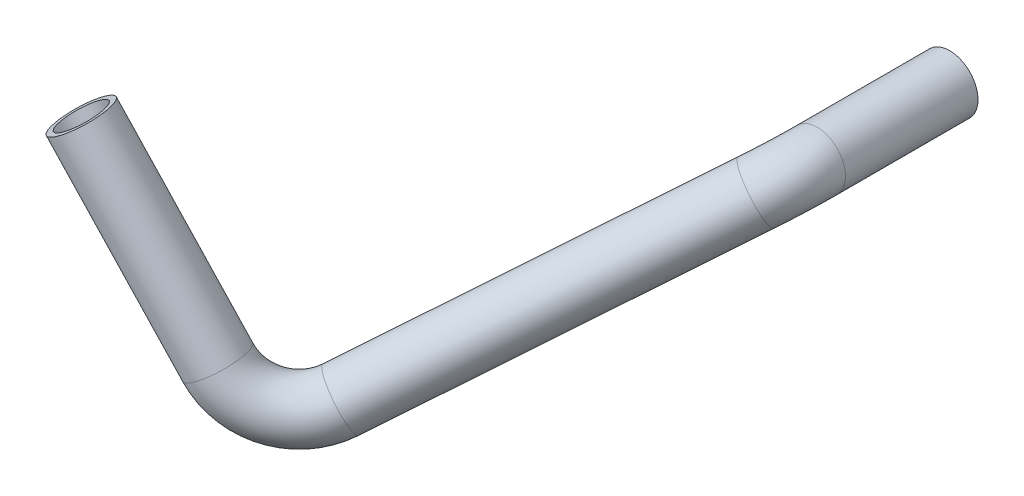
ISO-10303-21;
HEADER;
FILE_DESCRIPTION(('STEP AP214'),'2;1');
FILE_NAME('part.step','',(''),(''),'','','');
FILE_SCHEMA(('AUTOMOTIVE_DESIGN { 1 0 10303 214 1 1 1 1 }'));
ENDSEC;
DATA;
#1=APPLICATION_CONTEXT('core data for automotive mechanical design processes');
#2=APPLICATION_PROTOCOL_DEFINITION('international standard','automotive_design',2000,#1);
#3=PRODUCT_CONTEXT('',#1,'mechanical');
#4=PRODUCT('Part','Part','',(#3));
#5=PRODUCT_RELATED_PRODUCT_CATEGORY('part','',(#4));
#6=PRODUCT_DEFINITION_FORMATION('','',#4);
#7=PRODUCT_DEFINITION_CONTEXT('part definition',#1,'design');
#8=PRODUCT_DEFINITION('design','',#6,#7);
#9=PRODUCT_DEFINITION_SHAPE('','',#8);
#10=(LENGTH_UNIT() NAMED_UNIT(*) SI_UNIT(.MILLI.,.METRE.));
#11=(NAMED_UNIT(*) PLANE_ANGLE_UNIT() SI_UNIT($,.RADIAN.));
#12=(NAMED_UNIT(*) SI_UNIT($,.STERADIAN.) SOLID_ANGLE_UNIT());
#13=UNCERTAINTY_MEASURE_WITH_UNIT(LENGTH_MEASURE(1.E-05),#10,'distance_accuracy_value','');
#14=(GEOMETRIC_REPRESENTATION_CONTEXT(3) GLOBAL_UNCERTAINTY_ASSIGNED_CONTEXT((#13)) GLOBAL_UNIT_ASSIGNED_CONTEXT((#10,
#11,#12)) REPRESENTATION_CONTEXT('',''));
#15=CARTESIAN_POINT('',(0.,0.,0.));
#16=DIRECTION('',(0.,0.,1.));
#17=DIRECTION('',(1.,0.,0.));
#18=AXIS2_PLACEMENT_3D('',#15,#16,#17);
#19=CARTESIAN_POINT('',(0.,0.,0.));
#20=DIRECTION('',(0.,0.,1.));
#21=DIRECTION('',(1.,0.,0.));
#22=AXIS2_PLACEMENT_3D('',#19,#20,#21);
#23=PLANE('',#22);
#24=CARTESIAN_POINT('',(0.,0.,0.));
#25=DIRECTION('',(0.,0.,1.));
#26=DIRECTION('',(1.,0.,0.));
#27=AXIS2_PLACEMENT_3D('',#24,#25,#26);
#28=CIRCLE('',#27,16.764);
#29=CARTESIAN_POINT('',(16.764,0.,0.));
#30=VERTEX_POINT('',#29);
#31=EDGE_CURVE('E35',#30,#30,#28,.T.);
#32=ORIENTED_EDGE('',*,*,#31,.F.);
#33=EDGE_LOOP('',(#32));
#34=FACE_BOUND('',#33,.T.);
#35=CARTESIAN_POINT('',(0.,0.,0.));
#36=DIRECTION('',(0.,0.,1.));
#37=DIRECTION('',(1.,0.,0.));
#38=AXIS2_PLACEMENT_3D('',#35,#36,#37);
#39=CIRCLE('',#38,13.3858);
#40=CARTESIAN_POINT('',(13.3858,0.,0.));
#41=VERTEX_POINT('',#40);
#42=EDGE_CURVE('E42',#41,#41,#39,.T.);
#43=ORIENTED_EDGE('',*,*,#42,.T.);
#44=EDGE_LOOP('',(#43));
#45=FACE_BOUND('',#44,.T.);
#46=ADVANCED_FACE('F31',(#34,#45),#23,.F.);
#47=CARTESIAN_POINT('',(0.,0.,78.4330587896097));
#48=DIRECTION('',(0.,0.,-1.));
#49=DIRECTION('',(-1.,0.,0.));
#50=AXIS2_PLACEMENT_3D('',#47,#48,#49);
#51=CYLINDRICAL_SURFACE('',#50,16.764);
#52=CARTESIAN_POINT('',(0.,0.,78.4330587896097));
#53=DIRECTION('',(0.,0.,1.));
#54=DIRECTION('',(1.,0.,0.));
#55=AXIS2_PLACEMENT_3D('',#52,#53,#54);
#56=CIRCLE('',#55,16.764);
#57=CARTESIAN_POINT('',(12.8035668024698,10.8212925815123,78.4330587896097));
#58=VERTEX_POINT('',#57);
#59=EDGE_CURVE('E10',#58,#58,#56,.T.);
#60=ORIENTED_EDGE('',*,*,#59,.F.);
#61=EDGE_LOOP('',(#60));
#62=FACE_BOUND('',#61,.T.);
#63=ORIENTED_EDGE('',*,*,#31,.T.);
#64=EDGE_LOOP('',(#63));
#65=FACE_BOUND('',#64,.T.);
#66=ADVANCED_FACE('F33',(#62,#65),#51,.T.);
#67=CARTESIAN_POINT('',(0.,0.,78.4330587896097));
#68=DIRECTION('',(0.,0.,-1.));
#69=DIRECTION('',(-1.,0.,0.));
#70=AXIS2_PLACEMENT_3D('',#67,#68,#69);
#71=CYLINDRICAL_SURFACE('',#70,13.3858);
#72=CARTESIAN_POINT('',(0.,0.,78.4330587896097));
#73=DIRECTION('',(0.,0.,1.));
#74=DIRECTION('',(1.,0.,0.));
#75=AXIS2_PLACEMENT_3D('',#72,#73,#74);
#76=CIRCLE('',#75,13.3858);
#77=CARTESIAN_POINT('',(10.2234540983357,8.64063816735909,78.4330587896097));
#78=VERTEX_POINT('',#77);
#79=EDGE_CURVE('E49',#78,#78,#76,.T.);
#80=ORIENTED_EDGE('',*,*,#79,.T.);
#81=EDGE_LOOP('',(#80));
#82=FACE_BOUND('',#81,.T.);
#83=ORIENTED_EDGE('',*,*,#42,.F.);
#84=EDGE_LOOP('',(#83));
#85=FACE_BOUND('',#84,.T.);
#86=ADVANCED_FACE('F98',(#82,#85),#71,.F.);
#87=CARTESIAN_POINT('',(-29.0990154601586,-24.5938467761644,78.4330587896097));
#88=DIRECTION('',(-0.64550778940064,0.763753686618336,0.));
#89=DIRECTION('',(-0.763753686618336,-0.64550778940064,0.));
#90=AXIS2_PLACEMENT_3D('',#87,#88,#89);
#91=TOROIDAL_SURFACE('',#90,38.1,13.3858);
#92=CARTESIAN_POINT('',(-8.8192299398295,-7.45381884555164,105.756304237163));
#93=DIRECTION('',(-0.547722557505165,-0.462923038532848,0.696923425058677));
#94=DIRECTION('',(0.786241676829558,0.,0.617919109282311));
#95=AXIS2_PLACEMENT_3D('',#92,#93,#94);
#96=CIRCLE('',#95,13.3858);
#97=CARTESIAN_POINT('',(-1.69426529368721,-1.43195569926302,115.355871137737));
#98=VERTEX_POINT('',#97);
#99=EDGE_CURVE('E55',#98,#98,#96,.T.);
#100=CARTESIAN_POINT('',(-29.0990154601586,-24.5938467761644,78.4330587896097));
#101=DIRECTION('',(-0.64550778940064,0.763753686618336,0.));
#102=DIRECTION('',(-0.763753686618336,-0.64550778940064,0.));
#103=AXIS2_PLACEMENT_3D('',#100,#101,#102);
#104=CIRCLE('',#103,51.4858);
#105=EDGE_CURVE('',#98,#78,#104,.T.);
#106=ORIENTED_EDGE('',*,*,#99,.T.);
#107=ORIENTED_EDGE('',*,*,#79,.F.);
#108=ORIENTED_EDGE('',*,*,#105,.T.);
#109=ORIENTED_EDGE('',*,*,#105,.F.);
#110=EDGE_LOOP('',(#106,#108,#107,#109));
#111=FACE_BOUND('',#110,.T.);
#112=ADVANCED_FACE('F105',(#111),#91,.F.);
#113=CARTESIAN_POINT('',(-29.0990154601586,-24.5938467761644,78.4330587896097));
#114=DIRECTION('',(-0.64550778940064,0.763753686618336,0.));
#115=DIRECTION('',(-0.763753686618336,-0.64550778940064,0.));
#116=AXIS2_PLACEMENT_3D('',#113,#114,#115);
#117=TOROIDAL_SURFACE('',#116,38.1,16.764);
#118=CARTESIAN_POINT('',(-8.81922993982949,-7.45381884555162,105.756304237163));
#119=DIRECTION('',(-0.547722557505165,-0.462923038532848,0.696923425058677));
#120=DIRECTION('',(0.823209465100274,-0.149419465162081,0.547722557505165));
#121=AXIS2_PLACEMENT_3D('',#118,#119,#120);
#122=CIRCLE('',#121,16.764);
#123=CARTESIAN_POINT('',(0.103875689115317,0.0877934439180023,117.778532234087));
#124=VERTEX_POINT('',#123);
#125=EDGE_CURVE('E46',#124,#124,#122,.T.);
#126=CARTESIAN_POINT('',(-29.0990154601586,-24.5938467761644,78.4330587896097));
#127=DIRECTION('',(-0.64550778940064,0.763753686618336,0.));
#128=DIRECTION('',(-0.763753686618336,-0.64550778940064,0.));
#129=AXIS2_PLACEMENT_3D('',#126,#127,#128);
#130=CIRCLE('',#129,54.864);
#131=EDGE_CURVE('',#124,#58,#130,.T.);
#132=ORIENTED_EDGE('',*,*,#125,.F.);
#133=ORIENTED_EDGE('',*,*,#59,.T.);
#134=ORIENTED_EDGE('',*,*,#131,.T.);
#135=ORIENTED_EDGE('',*,*,#131,.F.);
#136=EDGE_LOOP('',(#132,#134,#133,#135));
#137=FACE_BOUND('',#136,.T.);
#138=ADVANCED_FACE('F107',(#137),#117,.T.);
#139=CARTESIAN_POINT('',(-116.960840040428,-98.8527251962934,243.355934323529));
#140=DIRECTION('',(0.547722557505165,0.462923038532848,-0.696923425058677));
#141=DIRECTION('',(-0.786241676829558,0.,-0.617919109282311));
#142=AXIS2_PLACEMENT_3D('',#139,#140,#141);
#143=CYLINDRICAL_SURFACE('',#142,16.764);
#144=CARTESIAN_POINT('',(-116.960840040428,-98.8527251962934,243.355934323529));
#145=DIRECTION('',(-0.547722557505165,-0.462923038532848,0.696923425058677));
#146=DIRECTION('',(0.786241676829558,0.,0.617919109282311));
#147=AXIS2_PLACEMENT_3D('',#144,#145,#146);
#148=CIRCLE('',#147,16.764);
#149=CARTESIAN_POINT('',(-107.778819086411,-112.734514316936,241.35140993854));
#150=VERTEX_POINT('',#149);
#151=EDGE_CURVE('E52',#150,#150,#148,.T.);
#152=ORIENTED_EDGE('',*,*,#151,.F.);
#153=EDGE_LOOP('',(#152));
#154=FACE_BOUND('',#153,.T.);
#155=ORIENTED_EDGE('',*,*,#125,.T.);
#156=EDGE_LOOP('',(#155));
#157=FACE_BOUND('',#156,.T.);
#158=ADVANCED_FACE('F110',(#154,#157),#143,.T.);
#159=CARTESIAN_POINT('',(-116.960840040428,-98.8527251962934,243.355934323529));
#160=DIRECTION('',(0.547722557505165,0.462923038532848,-0.696923425058677));
#161=DIRECTION('',(-0.786241676829558,0.,-0.617919109282311));
#162=AXIS2_PLACEMENT_3D('',#159,#160,#161);
#163=CYLINDRICAL_SURFACE('',#162,13.3858);
#164=CARTESIAN_POINT('',(-116.960840040428,-98.8527251962935,243.355934323529));
#165=DIRECTION('',(-0.547722557505165,-0.462923038532848,0.696923425058677));
#166=DIRECTION('',(0.786241676829558,0.,0.617919109282311));
#167=AXIS2_PLACEMENT_3D('',#164,#165,#166);
#168=CIRCLE('',#167,13.3858);
#169=CARTESIAN_POINT('',(-109.629135430175,-109.937123478988,241.755351973697));
#170=VERTEX_POINT('',#169);
#171=EDGE_CURVE('E61',#170,#170,#168,.T.);
#172=ORIENTED_EDGE('',*,*,#171,.T.);
#173=EDGE_LOOP('',(#172));
#174=FACE_BOUND('',#173,.T.);
#175=ORIENTED_EDGE('',*,*,#99,.F.);
#176=EDGE_LOOP('',(#175));
#177=FACE_BOUND('',#176,.T.);
#178=ADVANCED_FACE('F117',(#174,#177),#163,.F.);
#179=CARTESIAN_POINT('',(-137.829069481375,-67.3032044675606,247.91167156214));
#180=DIRECTION('',(0.632455532033677,0.316227766016838,0.707106781186547));
#181=DIRECTION('',(0.745355992499929,0.,-0.666666666666667));
#182=AXIS2_PLACEMENT_3D('',#179,#180,#181);
#183=TOROIDAL_SURFACE('',#182,38.1000000000002,13.3858);
#184=CARTESIAN_POINT('',(-158.697298922321,-84.9405722356622,274.464454056876));
#185=DIRECTION('',(-0.547722557505167,0.828071410202958,0.119573155869051));
#186=DIRECTION('',(-0.834055430380012,-0.551680649518916,0.));
#187=AXIS2_PLACEMENT_3D('',#184,#185,#186);
#188=CIRCLE('',#187,13.3858);
#189=CARTESIAN_POINT('',(-166.029003532574,-91.1371674448551,283.793331640026));
#190=VERTEX_POINT('',#189);
#191=EDGE_CURVE('E68',#190,#190,#188,.T.);
#192=CARTESIAN_POINT('',(-137.829069481375,-67.3032044675606,247.91167156214));
#193=DIRECTION('',(0.632455532033677,0.316227766016838,0.707106781186547));
#194=DIRECTION('',(0.745355992499929,0.,-0.666666666666667));
#195=AXIS2_PLACEMENT_3D('',#192,#193,#194);
#196=CIRCLE('',#195,51.4858000000002);
#197=EDGE_CURVE('',#190,#170,#196,.T.);
#198=ORIENTED_EDGE('',*,*,#191,.T.);
#199=ORIENTED_EDGE('',*,*,#171,.F.);
#200=ORIENTED_EDGE('',*,*,#197,.T.);
#201=ORIENTED_EDGE('',*,*,#197,.F.);
#202=EDGE_LOOP('',(#198,#200,#199,#201));
#203=FACE_BOUND('',#202,.T.);
#204=ADVANCED_FACE('F89',(#203),#183,.F.);
#205=CARTESIAN_POINT('',(-137.829069481375,-67.3032044675606,247.91167156214));
#206=DIRECTION('',(0.632455532033677,0.316227766016838,0.707106781186547));
#207=DIRECTION('',(0.745355992499929,0.,-0.666666666666667));
#208=AXIS2_PLACEMENT_3D('',#205,#206,#207);
#209=TOROIDAL_SURFACE('',#208,38.1000000000002,16.764);
#210=CARTESIAN_POINT('',(-158.697298922321,-84.9405722356621,274.464454056876));
#211=DIRECTION('',(-0.547722557505167,0.828071410202958,0.119573155869051));
#212=DIRECTION('',(0.395435317814638,0.130268786338307,0.909208970881162));
#213=AXIS2_PLACEMENT_3D('',#210,#211,#212);
#214=CIRCLE('',#213,16.764);
#215=CARTESIAN_POINT('',(-167.879319876338,-92.7010140536268,286.147678354559));
#216=VERTEX_POINT('',#215);
#217=EDGE_CURVE('E58',#216,#216,#214,.T.);
#218=CARTESIAN_POINT('',(-137.829069481375,-67.3032044675606,247.91167156214));
#219=DIRECTION('',(0.632455532033677,0.316227766016838,0.707106781186547));
#220=DIRECTION('',(0.745355992499929,0.,-0.666666666666667));
#221=AXIS2_PLACEMENT_3D('',#218,#219,#220);
#222=CIRCLE('',#221,54.8640000000002);
#223=EDGE_CURVE('',#216,#150,#222,.T.);
#224=ORIENTED_EDGE('',*,*,#217,.F.);
#225=ORIENTED_EDGE('',*,*,#151,.T.);
#226=ORIENTED_EDGE('',*,*,#223,.T.);
#227=ORIENTED_EDGE('',*,*,#223,.F.);
#228=EDGE_LOOP('',(#224,#226,#225,#227));
#229=FACE_BOUND('',#228,.T.);
#230=ADVANCED_FACE('F80',(#229),#209,.T.);
#231=CARTESIAN_POINT('',(-224.929951008013,15.1929075025049,288.923685510728));
#232=DIRECTION('',(-0.547722557505167,0.828071410202958,0.119573155869051));
#233=DIRECTION('',(-0.834055430380012,-0.551680649518916,0.));
#234=AXIS2_PLACEMENT_3D('',#231,#232,#233);
#235=PLANE('',#234);
#236=CARTESIAN_POINT('',(-224.929951008013,15.1929075025049,288.923685510728));
#237=DIRECTION('',(-0.547722557505167,0.828071410202958,0.119573155869051));
#238=DIRECTION('',(-0.834055430380012,-0.551680649518916,0.));
#239=AXIS2_PLACEMENT_3D('',#236,#237,#238);
#240=CIRCLE('',#239,16.764);
#241=CARTESIAN_POINT('',(-238.912056242904,5.94453309396977,288.923685510728));
#242=VERTEX_POINT('',#241);
#243=EDGE_CURVE('E64',#242,#242,#240,.T.);
#244=ORIENTED_EDGE('',*,*,#243,.T.);
#245=EDGE_LOOP('',(#244));
#246=FACE_BOUND('',#245,.T.);
#247=CARTESIAN_POINT('',(-224.929951008013,15.1929075025049,288.923685510728));
#248=DIRECTION('',(-0.547722557505167,0.828071410202958,0.119573155869051));
#249=DIRECTION('',(-0.834055430380012,-0.551680649518916,0.));
#250=AXIS2_PLACEMENT_3D('',#247,#248,#249);
#251=CIRCLE('',#250,13.3858);
#252=CARTESIAN_POINT('',(-236.094450187994,7.80822066417459,288.923685510728));
#253=VERTEX_POINT('',#252);
#254=EDGE_CURVE('E67',#253,#253,#251,.T.);
#255=ORIENTED_EDGE('',*,*,#254,.F.);
#256=EDGE_LOOP('',(#255));
#257=FACE_BOUND('',#256,.T.);
#258=ADVANCED_FACE('F77',(#246,#257),#235,.T.);
#259=CARTESIAN_POINT('',(-224.929951008013,15.1929075025049,288.923685510728));
#260=DIRECTION('',(0.547722557505167,-0.828071410202958,-0.119573155869051));
#261=DIRECTION('',(0.834055430380012,0.551680649518916,0.));
#262=AXIS2_PLACEMENT_3D('',#259,#260,#261);
#263=CYLINDRICAL_SURFACE('',#262,16.764);
#264=ORIENTED_EDGE('',*,*,#243,.F.);
#265=EDGE_LOOP('',(#264));
#266=FACE_BOUND('',#265,.T.);
#267=ORIENTED_EDGE('',*,*,#217,.T.);
#268=EDGE_LOOP('',(#267));
#269=FACE_BOUND('',#268,.T.);
#270=ADVANCED_FACE('F79',(#266,#269),#263,.T.);
#271=CARTESIAN_POINT('',(-224.929951008013,15.1929075025049,288.923685510728));
#272=DIRECTION('',(0.547722557505167,-0.828071410202958,-0.119573155869051));
#273=DIRECTION('',(0.834055430380012,0.551680649518916,0.));
#274=AXIS2_PLACEMENT_3D('',#271,#272,#273);
#275=CYLINDRICAL_SURFACE('',#274,13.3858);
#276=ORIENTED_EDGE('',*,*,#254,.T.);
#277=EDGE_LOOP('',(#276));
#278=FACE_BOUND('',#277,.T.);
#279=ORIENTED_EDGE('',*,*,#191,.F.);
#280=EDGE_LOOP('',(#279));
#281=FACE_BOUND('',#280,.T.);
#282=ADVANCED_FACE('F74',(#278,#281),#275,.F.);
#283=CLOSED_SHELL('',(#46,#66,#86,#112,#138,#158,#178,#204,#230,#258,#270,#282));
#284=MANIFOLD_SOLID_BREP('B2',#283);
#285=ADVANCED_BREP_SHAPE_REPRESENTATION('',(#18,#284),#14);
#286=SHAPE_DEFINITION_REPRESENTATION(#9,#285);
ENDSEC;
END-ISO-10303-21;
